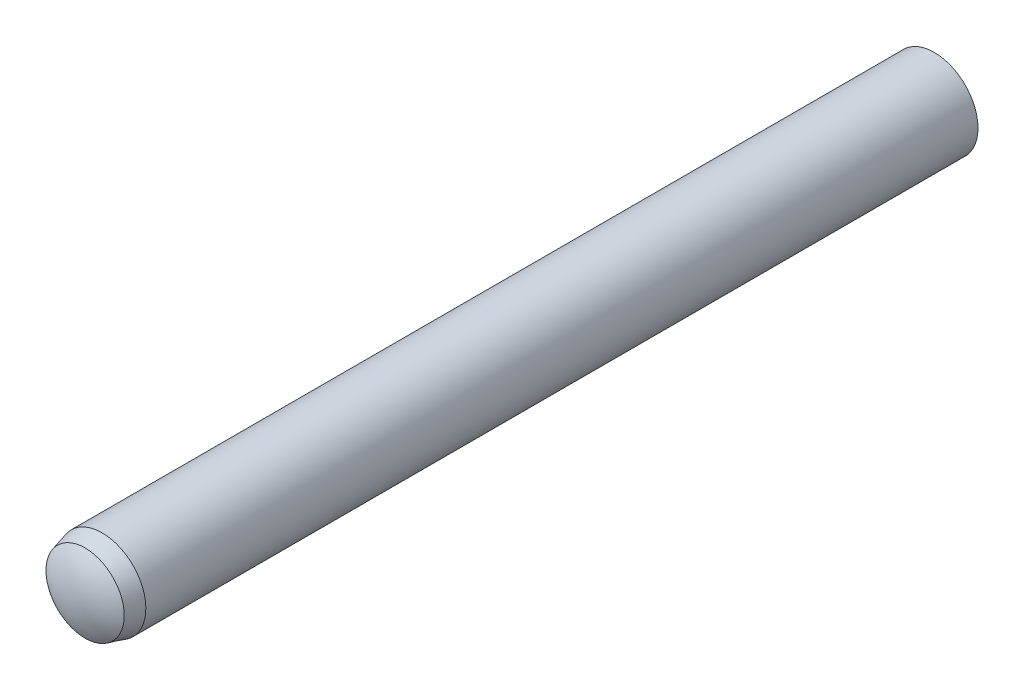
ISO-10303-21;
HEADER;
FILE_DESCRIPTION(('STEP AP214'),'2;1');
FILE_NAME('part.step','',(''),(''),'','','');
FILE_SCHEMA(('AUTOMOTIVE_DESIGN { 1 0 10303 214 1 1 1 1 }'));
ENDSEC;
DATA;
#1=APPLICATION_CONTEXT('core data for automotive mechanical design processes');
#2=APPLICATION_PROTOCOL_DEFINITION('international standard','automotive_design',2000,#1);
#3=PRODUCT_CONTEXT('',#1,'mechanical');
#4=PRODUCT('Part','Part','',(#3));
#5=PRODUCT_RELATED_PRODUCT_CATEGORY('part','',(#4));
#6=PRODUCT_DEFINITION_FORMATION('','',#4);
#7=PRODUCT_DEFINITION_CONTEXT('part definition',#1,'design');
#8=PRODUCT_DEFINITION('design','',#6,#7);
#9=PRODUCT_DEFINITION_SHAPE('','',#8);
#10=(LENGTH_UNIT() NAMED_UNIT(*) SI_UNIT(.MILLI.,.METRE.));
#11=(NAMED_UNIT(*) PLANE_ANGLE_UNIT() SI_UNIT($,.RADIAN.));
#12=(NAMED_UNIT(*) SI_UNIT($,.STERADIAN.) SOLID_ANGLE_UNIT());
#13=UNCERTAINTY_MEASURE_WITH_UNIT(LENGTH_MEASURE(1.E-05),#10,'distance_accuracy_value','');
#14=(GEOMETRIC_REPRESENTATION_CONTEXT(3) GLOBAL_UNCERTAINTY_ASSIGNED_CONTEXT((#13)) GLOBAL_UNIT_ASSIGNED_CONTEXT((#10,
#11,#12)) REPRESENTATION_CONTEXT('',''));
#15=CARTESIAN_POINT('',(0.,0.,0.));
#16=DIRECTION('',(0.,0.,1.));
#17=DIRECTION('',(1.,0.,0.));
#18=AXIS2_PLACEMENT_3D('',#15,#16,#17);
#19=CARTESIAN_POINT('',(0.,0.,-12.275));
#20=DIRECTION('',(0.,0.,1.));
#21=DIRECTION('',(0.,1.,0.));
#22=AXIS2_PLACEMENT_3D('',#19,#20,#21);
#23=SPHERICAL_SURFACE('',#22,2.72499999999998);
#24=CARTESIAN_POINT('',(0.,0.,-14.55));
#25=DIRECTION('',(0.,0.,1.));
#26=DIRECTION('',(0.,-1.,0.));
#27=AXIS2_PLACEMENT_3D('',#24,#25,#26);
#28=CIRCLE('',#27,1.5);
#29=CARTESIAN_POINT('',(0.,-1.49999999999999,-14.55));
#30=VERTEX_POINT('',#29);
#31=EDGE_CURVE('E10',#30,#30,#28,.T.);
#32=ORIENTED_EDGE('',*,*,#31,.F.);
#33=EDGE_LOOP('',(#32));
#34=FACE_BOUND('',#33,.T.);
#35=ADVANCED_FACE('F39',(#34),#23,.T.);
#36=CARTESIAN_POINT('',(0.,0.,15.));
#37=DIRECTION('',(0.,0.,1.));
#38=DIRECTION('',(0.,-1.,0.));
#39=AXIS2_PLACEMENT_3D('',#36,#37,#38);
#40=CYLINDRICAL_SURFACE('',#39,1.5);
#41=CARTESIAN_POINT('',(0.,0.,14.025));
#42=DIRECTION('',(0.,0.,1.));
#43=DIRECTION('',(0.,-1.,0.));
#44=AXIS2_PLACEMENT_3D('',#41,#42,#43);
#45=CIRCLE('',#44,1.5);
#46=CARTESIAN_POINT('',(0.,-1.5,14.025));
#47=VERTEX_POINT('',#46);
#48=EDGE_CURVE('E46',#47,#47,#45,.T.);
#49=ORIENTED_EDGE('',*,*,#48,.F.);
#50=EDGE_LOOP('',(#49));
#51=FACE_BOUND('',#50,.T.);
#52=ORIENTED_EDGE('',*,*,#31,.T.);
#53=EDGE_LOOP('',(#52));
#54=FACE_BOUND('',#53,.T.);
#55=ADVANCED_FACE('F68',(#51,#54),#40,.T.);
#56=CARTESIAN_POINT('',(0.,0.,14.025));
#57=DIRECTION('',(0.,0.,-1.));
#58=DIRECTION('',(0.,1.,0.));
#59=AXIS2_PLACEMENT_3D('',#56,#57,#58);
#60=CONICAL_SURFACE('',#59,1.5,0.26179938779915);
#61=CARTESIAN_POINT('',(0.,0.,14.61));
#62=DIRECTION('',(0.,0.,1.));
#63=DIRECTION('',(0.,-1.,0.));
#64=AXIS2_PLACEMENT_3D('',#61,#62,#63);
#65=CIRCLE('',#64,1.34324972242779);
#66=CARTESIAN_POINT('',(0.,-1.34324972242779,14.61));
#67=VERTEX_POINT('',#66);
#68=EDGE_CURVE('E55',#67,#67,#65,.T.);
#69=ORIENTED_EDGE('',*,*,#68,.F.);
#70=EDGE_LOOP('',(#69));
#71=FACE_BOUND('',#70,.T.);
#72=ORIENTED_EDGE('',*,*,#48,.T.);
#73=EDGE_LOOP('',(#72));
#74=FACE_BOUND('',#73,.T.);
#75=ADVANCED_FACE('F63',(#71,#74),#60,.T.);
#76=CARTESIAN_POINT('',(0.,0.,12.491769465638));
#77=DIRECTION('',(0.,0.,1.));
#78=DIRECTION('',(0.,1.,0.));
#79=AXIS2_PLACEMENT_3D('',#76,#77,#78);
#80=SPHERICAL_SURFACE('',#79,2.50823053436198);
#81=ORIENTED_EDGE('',*,*,#68,.T.);
#82=EDGE_LOOP('',(#81));
#83=FACE_BOUND('',#82,.T.);
#84=ADVANCED_FACE('F61',(#83),#80,.T.);
#85=CLOSED_SHELL('',(#35,#55,#75,#84));
#86=MANIFOLD_SOLID_BREP('B2',#85);
#87=ADVANCED_BREP_SHAPE_REPRESENTATION('',(#18,#86),#14);
#88=SHAPE_DEFINITION_REPRESENTATION(#9,#87);
ENDSEC;
END-ISO-10303-21;
